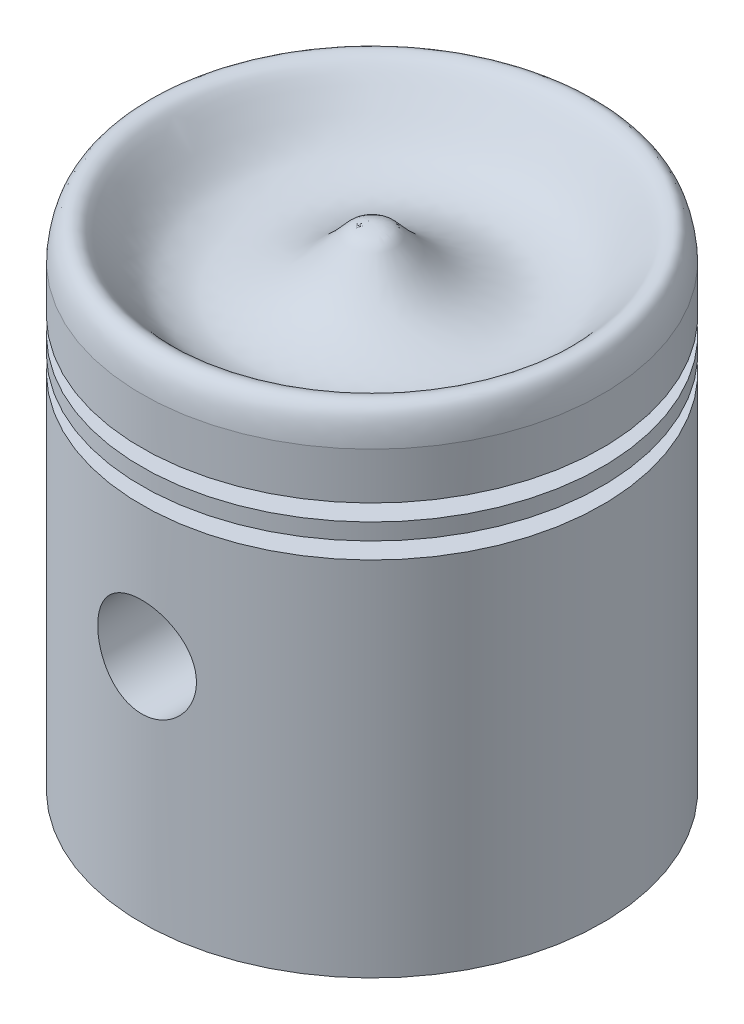
ISO-10303-21;
HEADER;
FILE_DESCRIPTION(('STEP AP214'),'2;1');
FILE_NAME('part.step','',(''),(''),'','','');
FILE_SCHEMA(('AUTOMOTIVE_DESIGN { 1 0 10303 214 1 1 1 1 }'));
ENDSEC;
DATA;
#1=APPLICATION_CONTEXT('core data for automotive mechanical design processes');
#2=APPLICATION_PROTOCOL_DEFINITION('international standard','automotive_design',2000,#1);
#3=PRODUCT_CONTEXT('',#1,'mechanical');
#4=PRODUCT('Part','Part','',(#3));
#5=PRODUCT_RELATED_PRODUCT_CATEGORY('part','',(#4));
#6=PRODUCT_DEFINITION_FORMATION('','',#4);
#7=PRODUCT_DEFINITION_CONTEXT('part definition',#1,'design');
#8=PRODUCT_DEFINITION('design','',#6,#7);
#9=PRODUCT_DEFINITION_SHAPE('','',#8);
#10=(LENGTH_UNIT() NAMED_UNIT(*) SI_UNIT(.MILLI.,.METRE.));
#11=(NAMED_UNIT(*) PLANE_ANGLE_UNIT() SI_UNIT($,.RADIAN.));
#12=(NAMED_UNIT(*) SI_UNIT($,.STERADIAN.) SOLID_ANGLE_UNIT());
#13=UNCERTAINTY_MEASURE_WITH_UNIT(LENGTH_MEASURE(1.E-05),#10,'distance_accuracy_value','');
#14=(GEOMETRIC_REPRESENTATION_CONTEXT(3) GLOBAL_UNCERTAINTY_ASSIGNED_CONTEXT((#13)) GLOBAL_UNIT_ASSIGNED_CONTEXT((#10,
#11,#12)) REPRESENTATION_CONTEXT('',''));
#15=CARTESIAN_POINT('',(0.,0.,0.));
#16=DIRECTION('',(0.,0.,1.));
#17=DIRECTION('',(1.,0.,0.));
#18=AXIS2_PLACEMENT_3D('',#15,#16,#17);
#19=CARTESIAN_POINT('',(1.19600567082175E-06,7.91996107381923,1.3474763766207E-05));
#20=DIRECTION('',(0.,-1.,0.));
#21=DIRECTION('',(0.,0.,-1.));
#22=AXIS2_PLACEMENT_3D('',#19,#20,#21);
#23=CONICAL_SURFACE('',#22,5.21420157956927,1.22173047639603);
#24=CARTESIAN_POINT('',(1.19600567082175E-06,9.81777524424625,1.3474763766207E-05));
#25=VERTEX_POINT('',#24);
#26=VERTEX_LOOP('',#25);
#27=FACE_BOUND('',#26,.T.);
#28=CARTESIAN_POINT('',(1.19600567082175E-06,7.91996107381923,1.3474763766207E-05));
#29=DIRECTION('',(0.,-1.,0.));
#30=DIRECTION('',(0.,0.,-1.));
#31=AXIS2_PLACEMENT_3D('',#28,#29,#30);
#32=CIRCLE('',#31,5.21420157956927);
#33=CARTESIAN_POINT('',(1.19600567082175E-06,7.91996107381923,-5.2141881048055));
#34=VERTEX_POINT('',#33);
#35=EDGE_CURVE('E82',#34,#34,#32,.T.);
#36=ORIENTED_EDGE('',*,*,#35,.T.);
#37=EDGE_LOOP('',(#36));
#38=FACE_BOUND('',#37,.T.);
#39=ADVANCED_FACE('F37',(#27,#38),#23,.F.);
#40=CARTESIAN_POINT('',(1.19600567881626E-06,13.0685139414464,1.3474763766207E-05));
#41=CARTESIAN_POINT('',(-0.281318780163342,13.0738620347917,1.3474763766207E-05));
#42=CARTESIAN_POINT('',(-0.771429235829669,12.9820264198062,1.3474763766207E-05));
#43=CARTESIAN_POINT('',(-1.48213308217972,12.148179381165,1.3474763766207E-05));
#44=CARTESIAN_POINT('',(-2.43239722922766,11.0926493268147,1.3474763766207E-05));
#45=CARTESIAN_POINT('',(-4.88677941059164,10.1867821782214,1.3474763766207E-05));
#46=CARTESIAN_POINT('',(-5.89422200956086,10.1979922281753,1.3474763766207E-05));
#47=CARTESIAN_POINT('',(-7.76024349303582,11.011464890764,1.3474763766207E-05));
#48=CARTESIAN_POINT('',(-9.02561347060041,12.8739887797501,1.3474763766207E-05));
#49=CARTESIAN_POINT('',(-9.85777467637345,13.2107307709268,1.3474763766207E-05));
#50=CARTESIAN_POINT('',(-10.3739113613338,13.0402652549594,1.3474763766207E-05));
#51=CARTESIAN_POINT('',(-10.4999988039943,11.5990791906284,1.3474763766207E-05));
#52=B_SPLINE_CURVE_WITH_KNOTS('',3,(#40,#41,#42,#43,#44,#45,#46,#47,#48,#49,#50,#51),
.UNSPECIFIED.,.F.,.F.,(4,1,1,1,1,1,1,1,1,4),(0.,0.0725474900971526,0.103319596306368,
0.285009788115958,0.33360778820772,0.540701597132226,0.586513163876913,0.745911888909903,
0.789253056585124,1.),.UNSPECIFIED.);
#53=CARTESIAN_POINT('',(1.19600567082175E-06,2.16213400546101,1.3474763766207E-05));
#54=DIRECTION('',(0.,-1.,0.));
#55=AXIS1_PLACEMENT('',#53,#54);
#56=SURFACE_OF_REVOLUTION('',#52,#55);
#57=CARTESIAN_POINT('',(1.19600567082175E-06,11.5990791906284,1.3474763766207E-05));
#58=DIRECTION('',(0.,-1.,0.));
#59=DIRECTION('',(0.,0.,-1.));
#60=AXIS2_PLACEMENT_3D('',#57,#58,#59);
#61=CIRCLE('',#60,10.5);
#62=CARTESIAN_POINT('',(1.19600567082175E-06,11.5990791906284,-10.4999865252362));
#63=VERTEX_POINT('',#62);
#64=EDGE_CURVE('E12',#63,#63,#61,.T.);
#65=ORIENTED_EDGE('',*,*,#64,.F.);
#66=EDGE_LOOP('',(#65));
#67=FACE_BOUND('',#66,.T.);
#68=CARTESIAN_POINT('',(1.19600567082175E-06,13.0685139414464,1.3474763766207E-05));
#69=VERTEX_POINT('',#68);
#70=VERTEX_LOOP('',#69);
#71=FACE_BOUND('',#70,.T.);
#72=ADVANCED_FACE('F57',(#67,#71),#56,.T.);
#73=CARTESIAN_POINT('',(1.19600567082175E-06,2.16213400546101,1.3474763766207E-05));
#74=DIRECTION('',(0.,-1.,0.));
#75=DIRECTION('',(0.,0.,-1.));
#76=AXIS2_PLACEMENT_3D('',#73,#74,#75);
#77=CYLINDRICAL_SURFACE('',#76,10.5);
#78=CARTESIAN_POINT('',(1.19600567082175E-06,9.47448732509958,1.3474763766207E-05));
#79=DIRECTION('',(0.,-1.,0.));
#80=DIRECTION('',(0.,0.,-1.));
#81=AXIS2_PLACEMENT_3D('',#78,#79,#80);
#82=CIRCLE('',#81,10.5);
#83=CARTESIAN_POINT('',(1.19600567082175E-06,9.47448732509958,-10.4999865252362));
#84=VERTEX_POINT('',#83);
#85=EDGE_CURVE('E50',#84,#84,#82,.T.);
#86=ORIENTED_EDGE('',*,*,#85,.F.);
#87=EDGE_LOOP('',(#86));
#88=FACE_BOUND('',#87,.T.);
#89=ORIENTED_EDGE('',*,*,#64,.T.);
#90=EDGE_LOOP('',(#89));
#91=FACE_BOUND('',#90,.T.);
#92=ADVANCED_FACE('F59',(#88,#91),#77,.T.);
#93=CARTESIAN_POINT('',(-10.4999988039943,9.47448732509958,1.3474763766207E-05));
#94=DIRECTION('',(0.,1.,0.));
#95=DIRECTION('',(0.,0.,1.));
#96=AXIS2_PLACEMENT_3D('',#93,#94,#95);
#97=PLANE('',#96);
#98=CARTESIAN_POINT('',(1.19600567082175E-06,9.47448732509958,1.3474763766207E-05));
#99=DIRECTION('',(0.,-1.,0.));
#100=DIRECTION('',(0.,0.,-1.));
#101=AXIS2_PLACEMENT_3D('',#98,#99,#100);
#102=CIRCLE('',#101,9.);
#103=CARTESIAN_POINT('',(1.19600567082175E-06,9.47448732509958,-8.99998652523623));
#104=VERTEX_POINT('',#103);
#105=EDGE_CURVE('E121',#104,#104,#102,.T.);
#106=ORIENTED_EDGE('',*,*,#105,.F.);
#107=EDGE_LOOP('',(#106));
#108=FACE_BOUND('',#107,.T.);
#109=ORIENTED_EDGE('',*,*,#85,.T.);
#110=EDGE_LOOP('',(#109));
#111=FACE_BOUND('',#110,.T.);
#112=ADVANCED_FACE('F65',(#108,#111),#97,.F.);
#113=CARTESIAN_POINT('',(1.19600567082175E-06,2.16213400546101,1.3474763766207E-05));
#114=DIRECTION('',(0.,-1.,0.));
#115=DIRECTION('',(0.,0.,-1.));
#116=AXIS2_PLACEMENT_3D('',#113,#114,#115);
#117=CYLINDRICAL_SURFACE('',#116,9.);
#118=CARTESIAN_POINT('',(1.19600567082175E-06,8.72448732509958,1.3474763766207E-05));
#119=DIRECTION('',(0.,-1.,0.));
#120=DIRECTION('',(0.,0.,-1.));
#121=AXIS2_PLACEMENT_3D('',#118,#119,#120);
#122=CIRCLE('',#121,9.);
#123=CARTESIAN_POINT('',(1.19600567082175E-06,8.72448732509958,-8.99998652523623));
#124=VERTEX_POINT('',#123);
#125=EDGE_CURVE('E118',#124,#124,#122,.T.);
#126=ORIENTED_EDGE('',*,*,#125,.F.);
#127=EDGE_LOOP('',(#126));
#128=FACE_BOUND('',#127,.T.);
#129=ORIENTED_EDGE('',*,*,#105,.T.);
#130=EDGE_LOOP('',(#129));
#131=FACE_BOUND('',#130,.T.);
#132=ADVANCED_FACE('F176',(#128,#131),#117,.T.);
#133=CARTESIAN_POINT('',(-10.4999988039943,8.72448732509958,1.3474763766207E-05));
#134=DIRECTION('',(0.,-1.,0.));
#135=DIRECTION('',(0.,0.,-1.));
#136=AXIS2_PLACEMENT_3D('',#133,#134,#135);
#137=PLANE('',#136);
#138=CARTESIAN_POINT('',(1.19600567082175E-06,8.72448732509958,1.3474763766207E-05));
#139=DIRECTION('',(0.,-1.,0.));
#140=DIRECTION('',(0.,0.,-1.));
#141=AXIS2_PLACEMENT_3D('',#138,#139,#140);
#142=CIRCLE('',#141,10.5);
#143=CARTESIAN_POINT('',(1.19600567082175E-06,8.72448732509958,-10.4999865252362));
#144=VERTEX_POINT('',#143);
#145=EDGE_CURVE('E115',#144,#144,#142,.T.);
#146=ORIENTED_EDGE('',*,*,#145,.F.);
#147=EDGE_LOOP('',(#146));
#148=FACE_BOUND('',#147,.T.);
#149=ORIENTED_EDGE('',*,*,#125,.T.);
#150=EDGE_LOOP('',(#149));
#151=FACE_BOUND('',#150,.T.);
#152=ADVANCED_FACE('F172',(#148,#151),#137,.F.);
#153=CARTESIAN_POINT('',(1.19600567082175E-06,2.16213400546101,1.3474763766207E-05));
#154=DIRECTION('',(0.,-1.,0.));
#155=DIRECTION('',(0.,0.,-1.));
#156=AXIS2_PLACEMENT_3D('',#153,#154,#155);
#157=CYLINDRICAL_SURFACE('',#156,10.5);
#158=CARTESIAN_POINT('',(1.19600567082175E-06,7.97448732509958,1.3474763766207E-05));
#159=DIRECTION('',(0.,-1.,0.));
#160=DIRECTION('',(0.,0.,-1.));
#161=AXIS2_PLACEMENT_3D('',#158,#159,#160);
#162=CIRCLE('',#161,10.5);
#163=CARTESIAN_POINT('',(1.19600567082175E-06,7.97448732509958,-10.4999865252362));
#164=VERTEX_POINT('',#163);
#165=EDGE_CURVE('E112',#164,#164,#162,.T.);
#166=ORIENTED_EDGE('',*,*,#165,.F.);
#167=EDGE_LOOP('',(#166));
#168=FACE_BOUND('',#167,.T.);
#169=ORIENTED_EDGE('',*,*,#145,.T.);
#170=EDGE_LOOP('',(#169));
#171=FACE_BOUND('',#170,.T.);
#172=ADVANCED_FACE('F168',(#168,#171),#157,.T.);
#173=CARTESIAN_POINT('',(-10.4999988039943,7.97448732509958,1.3474763766207E-05));
#174=DIRECTION('',(0.,1.,0.));
#175=DIRECTION('',(0.,0.,1.));
#176=AXIS2_PLACEMENT_3D('',#173,#174,#175);
#177=PLANE('',#176);
#178=CARTESIAN_POINT('',(1.19600567082175E-06,7.97448732509958,1.3474763766207E-05));
#179=DIRECTION('',(0.,-1.,0.));
#180=DIRECTION('',(0.,0.,-1.));
#181=AXIS2_PLACEMENT_3D('',#178,#179,#180);
#182=CIRCLE('',#181,9.);
#183=CARTESIAN_POINT('',(1.19600567082175E-06,7.97448732509958,-8.99998652523623));
#184=VERTEX_POINT('',#183);
#185=EDGE_CURVE('E109',#184,#184,#182,.T.);
#186=ORIENTED_EDGE('',*,*,#185,.F.);
#187=EDGE_LOOP('',(#186));
#188=FACE_BOUND('',#187,.T.);
#189=ORIENTED_EDGE('',*,*,#165,.T.);
#190=EDGE_LOOP('',(#189));
#191=FACE_BOUND('',#190,.T.);
#192=ADVANCED_FACE('F164',(#188,#191),#177,.F.);
#193=CARTESIAN_POINT('',(1.19600567082175E-06,2.16213400546101,1.3474763766207E-05));
#194=DIRECTION('',(0.,-1.,0.));
#195=DIRECTION('',(0.,0.,-1.));
#196=AXIS2_PLACEMENT_3D('',#193,#194,#195);
#197=CYLINDRICAL_SURFACE('',#196,9.);
#198=CARTESIAN_POINT('',(1.19600567082175E-06,7.22448732509958,1.3474763766207E-05));
#199=DIRECTION('',(0.,-1.,0.));
#200=DIRECTION('',(0.,0.,-1.));
#201=AXIS2_PLACEMENT_3D('',#198,#199,#200);
#202=CIRCLE('',#201,9.);
#203=CARTESIAN_POINT('',(1.19600567082175E-06,7.22448732509958,-8.99998652523623));
#204=VERTEX_POINT('',#203);
#205=EDGE_CURVE('E106',#204,#204,#202,.T.);
#206=ORIENTED_EDGE('',*,*,#205,.F.);
#207=EDGE_LOOP('',(#206));
#208=FACE_BOUND('',#207,.T.);
#209=ORIENTED_EDGE('',*,*,#185,.T.);
#210=EDGE_LOOP('',(#209));
#211=FACE_BOUND('',#210,.T.);
#212=ADVANCED_FACE('F160',(#208,#211),#197,.T.);
#213=CARTESIAN_POINT('',(-10.4999988039943,7.22448732509958,1.3474763766207E-05));
#214=DIRECTION('',(0.,-1.,0.));
#215=DIRECTION('',(0.,0.,-1.));
#216=AXIS2_PLACEMENT_3D('',#213,#214,#215);
#217=PLANE('',#216);
#218=CARTESIAN_POINT('',(1.19600567082175E-06,7.22448732509958,1.3474763766207E-05));
#219=DIRECTION('',(0.,-1.,0.));
#220=DIRECTION('',(0.,0.,-1.));
#221=AXIS2_PLACEMENT_3D('',#218,#219,#220);
#222=CIRCLE('',#221,10.5);
#223=CARTESIAN_POINT('',(1.19600567082175E-06,7.22448732509958,-10.4999865252362));
#224=VERTEX_POINT('',#223);
#225=EDGE_CURVE('E103',#224,#224,#222,.T.);
#226=ORIENTED_EDGE('',*,*,#225,.F.);
#227=EDGE_LOOP('',(#226));
#228=FACE_BOUND('',#227,.T.);
#229=ORIENTED_EDGE('',*,*,#205,.T.);
#230=EDGE_LOOP('',(#229));
#231=FACE_BOUND('',#230,.T.);
#232=ADVANCED_FACE('F154',(#228,#231),#217,.F.);
#233=CARTESIAN_POINT('',(1.19600567082175E-06,2.16213400546101,1.3474763766207E-05));
#234=DIRECTION('',(0.,-1.,0.));
#235=DIRECTION('',(0.,0.,-1.));
#236=AXIS2_PLACEMENT_3D('',#233,#234,#235);
#237=CYLINDRICAL_SURFACE('',#236,10.5);
#238=CARTESIAN_POINT('',(1.19600567082175E-06,3.47448732509958,-10.4999865252362));
#239=CARTESIAN_POINT('',(-0.124852633130254,3.47448297573813,-10.4999842158846));
#240=CARTESIAN_POINT('',(-0.249759597394741,3.4640599125178,-10.4977369144819));
#241=CARTESIAN_POINT('',(-0.49602982043432,3.42268383981919,-10.4889889726521));
#242=CARTESIAN_POINT('',(-0.617390409351114,3.39171575880718,-10.4824852097927));
#243=CARTESIAN_POINT('',(-0.852972789720934,3.31026077818753,-10.4659490020686));
#244=CARTESIAN_POINT('',(-0.967201749164163,3.2597938560276,-10.4559201697438));
#245=CARTESIAN_POINT('',(-1.18556607093551,3.14083619584268,-10.4334181275058));
#246=CARTESIAN_POINT('',(-1.28970177661538,3.07234607122467,-10.4209450007861));
#247=CARTESIAN_POINT('',(-1.48653598979717,2.91816687558932,-10.3947070639309));
#248=CARTESIAN_POINT('',(-1.57905635528601,2.83225299225179,-10.3809267723851));
#249=CARTESIAN_POINT('',(-1.74848943983585,2.64614785157178,-10.3537375724484));
#250=CARTESIAN_POINT('',(-1.82540081125795,2.54595536272269,-10.3403286962107));
#251=CARTESIAN_POINT('',(-1.96221186969146,2.33282869580893,-10.3152482659446));
#252=CARTESIAN_POINT('',(-2.02192317901946,2.21977104846527,-10.3035965704016));
#253=CARTESIAN_POINT('',(-2.12143115936154,1.98493564444932,-10.2835714086143));
#254=CARTESIAN_POINT('',(-2.16123010902007,1.86315888736072,-10.2751975672969));
#255=CARTESIAN_POINT('',(-2.21919742033115,1.61627069521747,-10.2628336591309));
#256=CARTESIAN_POINT('',(-2.23768050021947,1.49123641160378,-10.2587798786835));
#257=CARTESIAN_POINT('',(-2.25346973209298,1.23978097633909,-10.2553236229128));
#258=CARTESIAN_POINT('',(-2.25077837896377,1.11335998982966,-10.2559205996122));
#259=CARTESIAN_POINT('',(-2.22454869910725,0.865050293198891,-10.2616406742937));
#260=CARTESIAN_POINT('',(-2.20137478373545,0.74312099144935,-10.2666846504687));
#261=CARTESIAN_POINT('',(-2.13541461847448,0.504921964665567,-10.280605425873));
#262=CARTESIAN_POINT('',(-2.09262730804131,0.388652546051099,-10.2894824323623));
#263=CARTESIAN_POINT('',(-1.9883170701342,0.164043015789572,-10.3101477365721));
#264=CARTESIAN_POINT('',(-1.92665296858678,0.0557705560307528,-10.3219578399867));
#265=CARTESIAN_POINT('',(-1.78643891325423,-0.149025422337356,-10.3471451127556));
#266=CARTESIAN_POINT('',(-1.70788674554776,-0.245547397929723,-10.3605224874647));
#267=CARTESIAN_POINT('',(-1.53419194532413,-0.426201708410517,-10.3876773011444));
#268=CARTESIAN_POINT('',(-1.43873915494094,-0.510035734777526,-10.4014572848189));
#269=CARTESIAN_POINT('',(-1.23497476339797,-0.66055327543491,-10.4276117876921));
#270=CARTESIAN_POINT('',(-1.12666294715743,-0.727236502801003,-10.4399862833758));
#271=CARTESIAN_POINT('',(-0.899898997069268,-0.841628694760814,-10.4619732032463));
#272=CARTESIAN_POINT('',(-0.781427192289552,-0.889299793767394,-10.4715801048865));
#273=CARTESIAN_POINT('',(-0.537903524022888,-0.963976147382047,-10.4869081639162));
#274=CARTESIAN_POINT('',(-0.412852580694832,-0.990984283745393,-10.492629863142));
#275=CARTESIAN_POINT('',(-0.162280310249273,-1.02313699611555,-10.4994661204534));
#276=CARTESIAN_POINT('',(-0.0368135699017512,-1.02868924422309,-10.5006665730522));
#277=CARTESIAN_POINT('',(0.213254656481278,-1.01887581821267,-10.4985652592758));
#278=CARTESIAN_POINT('',(0.337856198196554,-1.00351150295601,-10.4952637853717));
#279=CARTESIAN_POINT('',(0.581315002979879,-0.952639309407866,-10.4845836709152));
#280=CARTESIAN_POINT('',(0.700218765368386,-0.917344120691619,-10.4772481009181));
#281=CARTESIAN_POINT('',(0.930418871715797,-0.827847260408187,-10.4593203915589));
#282=CARTESIAN_POINT('',(1.04171458488728,-0.773644023432938,-10.4487279825698));
#283=CARTESIAN_POINT('',(1.2552332929528,-0.64701236030993,-10.4252490910922));
#284=CARTESIAN_POINT('',(1.35731005867238,-0.574342982535828,-10.4123329955504));
#285=CARTESIAN_POINT('',(1.54796658429106,-0.413160437567316,-10.3857020207589));
#286=CARTESIAN_POINT('',(1.63654466404366,-0.324645301069255,-10.3719870423677));
#287=CARTESIAN_POINT('',(1.79929186187551,-0.132416619619716,-10.3450091158311));
#288=CARTESIAN_POINT('',(1.87317925483302,-0.0284625260672644,-10.3317584085555));
#289=CARTESIAN_POINT('',(2.00244742679628,0.19061921981657,-10.3074863436314));
#290=CARTESIAN_POINT('',(2.05782899471125,0.305746395565819,-10.2964648909571));
#291=CARTESIAN_POINT('',(2.14814731473389,0.543295773591486,-10.2780016723471));
#292=CARTESIAN_POINT('',(2.1831971756248,0.665673359745584,-10.2705401439807));
#293=CARTESIAN_POINT('',(2.2321916372857,0.914760700850035,-10.2600043258625));
#294=CARTESIAN_POINT('',(2.24613945770953,1.04146979190156,-10.2569293668318));
#295=CARTESIAN_POINT('',(2.25240119489628,1.29278583986245,-10.2555558079586));
#296=CARTESIAN_POINT('',(2.24516140488034,1.41738134757045,-10.2571586730144));
#297=CARTESIAN_POINT('',(2.21024803710063,1.66353318829846,-10.2647379730087));
#298=CARTESIAN_POINT('',(2.18257468037536,1.78508955417944,-10.2707143606369));
#299=CARTESIAN_POINT('',(2.10779138511218,2.02137531190333,-10.2863202417986));
#300=CARTESIAN_POINT('',(2.06074390356897,2.13612529809602,-10.2959379886068));
#301=CARTESIAN_POINT('',(1.94860246993968,2.35617038385985,-10.317747994096));
#302=CARTESIAN_POINT('',(1.88350672552817,2.46146454302215,-10.3299405084417));
#303=CARTESIAN_POINT('',(1.73562555124523,2.66181461568763,-10.3558223591347));
#304=CARTESIAN_POINT('',(1.65252100732422,2.75663186902005,-10.3695361743201));
#305=CARTESIAN_POINT('',(1.4716310279351,2.93112171888027,-10.3967482722317));
#306=CARTESIAN_POINT('',(1.37384221008407,3.01079081656789,-10.4102465045057));
#307=CARTESIAN_POINT('',(1.16490591690875,3.15366126435792,-10.435703890971));
#308=CARTESIAN_POINT('',(1.05360846502013,3.21664723444605,-10.4476419937956));
#309=CARTESIAN_POINT('',(0.821776437416568,3.32291911845885,-10.4684239167965));
#310=CARTESIAN_POINT('',(0.70124985480149,3.36622185897713,-10.4772703784214));
#311=CARTESIAN_POINT('',(0.483804022335477,3.4240156027963,-10.4892592521628));
#312=CARTESIAN_POINT('',(0.38807700432464,3.44290697606963,-10.4932574035602));
#313=CARTESIAN_POINT('',(0.194911137286441,3.46814427766708,-10.498621887557));
#314=CARTESIAN_POINT('',(0.0974723586387885,3.47449072056867,-10.4999883281059));
#315=CARTESIAN_POINT('',(1.19600567082175E-06,3.47448732509958,-10.4999865252362));
#316=B_SPLINE_CURVE_WITH_KNOTS('',3,(#238,#239,#240,#241,#242,#243,#244,#245,#246,#247,#248,
#249,#250,#251,#252,#253,#254,#255,#256,#257,#258,#259,#260,#261,#262,#263,#264,#265,#266,#267,
#268,#269,#270,#271,#272,#273,#274,#275,#276,#277,#278,#279,#280,#281,#282,#283,#284,#285,#286,
#287,#288,#289,#290,#291,#292,#293,#294,#295,#296,#297,#298,#299,#300,#301,#302,#303,#304,#305,
#306,#307,#308,#309,#310,#311,#312,#313,#314,#315),.UNSPECIFIED.,.T.,.F.,(4,2,2,2,2,2,2,2,2,2,2,
2,2,2,2,2,2,2,2,2,2,2,2,2,2,2,2,2,2,2,2,2,2,2,2,2,2,2,4),(0.,0.374204754768123,
0.748684324829904,1.1227812366384,1.49686541796883,1.87612442822598,2.2554161687776,
2.63871643821766,3.02197283516234,3.39949512186999,3.77697292753747,4.14786713179391,
4.51878139356852,4.89254034248952,5.26634831881334,5.64790516575436,6.02946839553525,
6.41178781709709,6.79405390884515,7.16901998556277,7.54396170347144,7.91497590883901,
8.28602083797651,8.66218100801704,9.03838795956727,9.42123094925301,9.80405761613708,
10.1847336061271,10.5653515084378,10.9380102081044,11.310664876624,11.6821274956018,
12.0536270167743,12.4323442523117,12.8111488559567,13.1946286553583,13.5777800101541,
13.8699269869844,14.16206198006),.UNSPECIFIED.);
#317=CARTESIAN_POINT('',(1.19600567082175E-06,3.47448732509958,-10.4999865252362));
#318=VERTEX_POINT('',#317);
#319=EDGE_CURVE('E76',#318,#318,#316,.T.);
#320=ORIENTED_EDGE('',*,*,#319,.T.);
#321=EDGE_LOOP('',(#320));
#322=FACE_BOUND('',#321,.T.);
#323=CARTESIAN_POINT('',(2.25000119600567,1.22448732509958,10.2561092231468));
#324=CARTESIAN_POINT('',(2.24999681958582,1.09967059637506,10.2561117431727));
#325=CARTESIAN_POINT('',(2.23957973967744,0.974800664185972,10.2584125598993));
#326=CARTESIAN_POINT('',(2.19822958480041,0.728607316737,10.2673511512052));
#327=CARTESIAN_POINT('',(2.16728129080993,0.607286602085386,10.2739921429396));
#328=CARTESIAN_POINT('',(2.08588415127473,0.371788700738159,10.2908252041667));
#329=CARTESIAN_POINT('',(2.0354562108754,0.257604007917351,10.3010134656516));
#330=CARTESIAN_POINT('',(1.91659046110576,0.039314414182696,10.323788537493));
#331=CARTESIAN_POINT('',(1.8481531767373,-0.0647907804440253,10.3363752779268));
#332=CARTESIAN_POINT('',(1.69402833455899,-0.26165711712361,10.3627571567137));
#333=CARTESIAN_POINT('',(1.60810408826541,-0.354230989260364,10.3765672228401));
#334=CARTESIAN_POINT('',(1.42195545820004,-0.523768006509095,10.4037088504197));
#335=CARTESIAN_POINT('',(1.32172999133218,-0.600729968190523,10.417040375535));
#336=CARTESIAN_POINT('',(1.10857212870254,-0.73759584163757,10.4418850114053));
#337=CARTESIAN_POINT('',(0.995521928350601,-0.797320158556347,10.4533784570552));
#338=CARTESIAN_POINT('',(0.760702600019564,-0.896854212069855,10.4730835404078));
#339=CARTESIAN_POINT('',(0.638934412076139,-0.93666609207984,10.4812955313137));
#340=CARTESIAN_POINT('',(0.392081977512938,-0.99465763129743,10.4934069539815));
#341=CARTESIAN_POINT('',(0.267075296901056,-1.01315406772906,10.4973694754395));
#342=CARTESIAN_POINT('',(0.0156746139656379,-1.02897959087031,10.5007539078688));
#343=CARTESIAN_POINT('',(-0.110719234241468,-1.02631100574155,10.5001763182542));
#344=CARTESIAN_POINT('',(-0.359124347870097,-1.00011922790504,10.4945939877021));
#345=CARTESIAN_POINT('',(-0.481173477037498,-0.976937424465538,10.4896617220502));
#346=CARTESIAN_POINT('',(-0.719607999961912,-0.910920652122624,10.4760065986003));
#347=CARTESIAN_POINT('',(-0.83599314425691,-0.868084818450808,10.4672835740115));
#348=CARTESIAN_POINT('',(-1.06075005032916,-0.76367048656764,10.4469097944666));
#349=CARTESIAN_POINT('',(-1.16905928951801,-0.701961524093898,10.435238761823));
#350=CARTESIAN_POINT('',(-1.3739101938386,-0.561649722655022,10.4102503809217));
#351=CARTESIAN_POINT('',(-1.47045031367162,-0.483044668949968,10.3969328169342));
#352=CARTESIAN_POINT('',(-1.6510519359973,-0.309309858108623,10.3698033716776));
#353=CARTESIAN_POINT('',(-1.73482556379809,-0.213881305864867,10.3559869303566));
#354=CARTESIAN_POINT('',(-1.88523245251525,-0.0101877472976592,10.3296669772434));
#355=CARTESIAN_POINT('',(-1.95186528576535,0.098077579207454,10.3171634982146));
#356=CARTESIAN_POINT('',(-2.06621996759378,0.324824076695221,10.2948738285646));
#357=CARTESIAN_POINT('',(-2.11388933032817,0.44333251087824,10.2850952016804));
#358=CARTESIAN_POINT('',(-2.18855123138106,0.68693647401924,10.269468586863));
#359=CARTESIAN_POINT('',(-2.21554690441375,0.812031001264367,10.263620003041));
#360=CARTESIAN_POINT('',(-2.24765259436411,1.06263095407415,10.2566366935955));
#361=CARTESIAN_POINT('',(-2.25318093292393,1.18808033771554,10.2554118805393));
#362=CARTESIAN_POINT('',(-2.24332589862993,1.43810831487212,10.2575720683737));
#363=CARTESIAN_POINT('',(-2.22794390021886,1.56268696507991,10.2609567662797));
#364=CARTESIAN_POINT('',(-2.17706722352809,1.80599297757072,10.2718697070268));
#365=CARTESIAN_POINT('',(-2.14180125776763,1.92477047399502,10.2793508038792));
#366=CARTESIAN_POINT('',(-2.05240459819557,2.15473083139896,10.2975713728104));
#367=CARTESIAN_POINT('',(-1.9982721589366,2.26591298855087,10.3083111463565));
#368=CARTESIAN_POINT('',(-1.8717513702449,2.47934185223796,10.3320379859689));
#369=CARTESIAN_POINT('',(-1.79910433285621,2.58143169811786,10.3450560009585));
#370=CARTESIAN_POINT('',(-1.63795656149834,2.77212484391027,10.3717901051659));
#371=CARTESIAN_POINT('',(-1.54945394172674,2.86072653727228,10.3855062772807));
#372=CARTESIAN_POINT('',(-1.35721795062555,3.02354277951672,10.4123870746164));
#373=CARTESIAN_POINT('',(-1.25324119273748,3.0974726993351,10.42553750888));
#374=CARTESIAN_POINT('',(-1.03410102591774,3.22681543912615,10.4495476354873));
#375=CARTESIAN_POINT('',(-0.918938128059937,3.28222910455883,10.4604074324142));
#376=CARTESIAN_POINT('',(-0.68139693246739,3.3725654070573,10.4785526504874));
#377=CARTESIAN_POINT('',(-0.55906859360709,3.407614780719,10.4858601318192));
#378=CARTESIAN_POINT('',(-0.310086569499262,3.45662488369806,10.4961725642935));
#379=CARTESIAN_POINT('',(-0.183433488955313,3.47058854906044,10.4991781144483));
#380=CARTESIAN_POINT('',(0.0678967715849089,3.47690330371738,10.5005311398995));
#381=CARTESIAN_POINT('',(0.192562954269494,3.46968006300655,10.4989703597883));
#382=CARTESIAN_POINT('',(0.438860603629634,3.434775179821,10.491561760215));
#383=CARTESIAN_POINT('',(0.560492120613678,3.40709387673196,10.4857140118709));
#384=CARTESIAN_POINT('',(0.796954118736496,3.33225911572548,10.47039430434));
#385=CARTESIAN_POINT('',(0.911803743615142,3.28516379102176,10.4609331712145));
#386=CARTESIAN_POINT('',(1.1320286310908,3.17289541834539,10.4393990155304));
#387=CARTESIAN_POINT('',(1.23740301320098,3.10772069263862,10.4273257505939));
#388=CARTESIAN_POINT('',(1.43776965634742,2.95974384698752,10.4016106237557));
#389=CARTESIAN_POINT('',(1.53253674366012,2.87664108762495,10.387944108286));
#390=CARTESIAN_POINT('',(1.70692621787452,2.69577640971671,10.3607188259972));
#391=CARTESIAN_POINT('',(1.78654496695774,2.59801098003874,10.3471600858072));
#392=CARTESIAN_POINT('',(1.92935011994238,2.38910158534515,10.3214938791793));
#393=CARTESIAN_POINT('',(1.9923146630945,2.2778032877655,10.309407062749));
#394=CARTESIAN_POINT('',(2.0985462658477,2.04597174381196,10.2883109318478));
#395=CARTESIAN_POINT('',(2.14183029235112,1.92544655724569,10.2792989681744));
#396=CARTESIAN_POINT('',(2.19958030283823,1.70804812830532,10.2670718846324));
#397=CARTESIAN_POINT('',(2.21845248362431,1.61236981153366,10.2629877211475));
#398=CARTESIAN_POINT('',(2.24366435665474,1.41930085773778,10.2575054672654));
#399=CARTESIAN_POINT('',(2.25000461192465,1.32191029783835,10.2561072561956));
#400=CARTESIAN_POINT('',(2.25000119600567,1.22448732509958,10.2561092231468));
#401=B_SPLINE_CURVE_WITH_KNOTS('',3,(#323,#324,#325,#326,#327,#328,#329,#330,#331,#332,#333,
#334,#335,#336,#337,#338,#339,#340,#341,#342,#343,#344,#345,#346,#347,#348,#349,#350,#351,#352,
#353,#354,#355,#356,#357,#358,#359,#360,#361,#362,#363,#364,#365,#366,#367,#368,#369,#370,#371,
#372,#373,#374,#375,#376,#377,#378,#379,#380,#381,#382,#383,#384,#385,#386,#387,#388,#389,#390,
#391,#392,#393,#394,#395,#396,#397,#398,#399,#400),.UNSPECIFIED.,.T.,.F.,(4,2,2,2,2,2,2,2,2,2,2,
2,2,2,2,2,2,2,2,2,2,2,2,2,2,2,2,2,2,2,2,2,2,2,2,2,2,2,4),(0.,0.374093223041292,
0.748464057719946,1.12243423672914,1.49639351510292,1.87579844374038,2.25523212169318,
2.63848702230417,3.02170065969401,3.39914262227893,3.77654306665861,4.14777836501057,
4.51902999911376,4.89290832215156,5.26683568308472,5.64823441168942,6.02964265534638,
6.41209931117671,6.79449796430758,7.16940649788784,7.54429038980875,7.91494771124062,
8.28563933344725,8.66182515324477,9.03805574488617,9.42099322024815,9.80391320813312,
10.1844238473656,10.5648814981281,10.9377479946619,11.3106083057265,11.6823601442922,
12.0541464922705,12.4327337124145,12.8114117344685,13.1949057025222,13.5780684242056,
13.8700718418644,14.1620621403007),.UNSPECIFIED.);
#402=CARTESIAN_POINT('',(2.25000119600567,1.22448732509958,10.2561092231468));
#403=VERTEX_POINT('',#402);
#404=EDGE_CURVE('E143',#403,#403,#401,.T.);
#405=ORIENTED_EDGE('',*,*,#404,.T.);
#406=EDGE_LOOP('',(#405));
#407=FACE_BOUND('',#406,.T.);
#408=CARTESIAN_POINT('',(1.19600567082175E-06,-9.27551267490042,1.3474763766207E-05));
#409=DIRECTION('',(0.,-1.,0.));
#410=DIRECTION('',(0.,0.,-1.));
#411=AXIS2_PLACEMENT_3D('',#408,#409,#410);
#412=CIRCLE('',#411,10.5);
#413=CARTESIAN_POINT('',(1.19600567082175E-06,-9.27551267490042,-10.4999865252362));
#414=VERTEX_POINT('',#413);
#415=EDGE_CURVE('E100',#414,#414,#412,.T.);
#416=ORIENTED_EDGE('',*,*,#415,.F.);
#417=EDGE_LOOP('',(#416));
#418=FACE_BOUND('',#417,.T.);
#419=ORIENTED_EDGE('',*,*,#225,.T.);
#420=EDGE_LOOP('',(#419));
#421=FACE_BOUND('',#420,.T.);
#422=ADVANCED_FACE('F148',(#322,#407,#418,#421),#237,.T.);
#423=CARTESIAN_POINT('',(-10.4999988039943,-9.27551267490042,1.3474763766207E-05));
#424=DIRECTION('',(0.,1.,0.));
#425=DIRECTION('',(0.,0.,1.));
#426=AXIS2_PLACEMENT_3D('',#423,#424,#425);
#427=PLANE('',#426);
#428=CARTESIAN_POINT('',(1.19600567082175E-06,-9.27551267490042,1.3474763766207E-05));
#429=DIRECTION('',(0.,-1.,0.));
#430=DIRECTION('',(0.,0.,-1.));
#431=AXIS2_PLACEMENT_3D('',#428,#429,#430);
#432=CIRCLE('',#431,9.375);
#433=CARTESIAN_POINT('',(1.19600567082175E-06,-9.27551267490042,-9.37498652523623));
#434=VERTEX_POINT('',#433);
#435=EDGE_CURVE('E97',#434,#434,#432,.T.);
#436=ORIENTED_EDGE('',*,*,#435,.F.);
#437=EDGE_LOOP('',(#436));
#438=FACE_BOUND('',#437,.T.);
#439=ORIENTED_EDGE('',*,*,#415,.T.);
#440=EDGE_LOOP('',(#439));
#441=FACE_BOUND('',#440,.T.);
#442=ADVANCED_FACE('F153',(#438,#441),#427,.F.);
#443=CARTESIAN_POINT('',(1.19600567082175E-06,-9.27551267490042,1.3474763766207E-05));
#444=DIRECTION('',(0.,-1.,0.));
#445=DIRECTION('',(0.,0.,-1.));
#446=AXIS2_PLACEMENT_3D('',#443,#444,#445);
#447=CONICAL_SURFACE('',#446,9.375,0.349065850398866);
#448=CARTESIAN_POINT('',(1.19600567082175E-06,-4.33236855913765,1.3474763766207E-05));
#449=DIRECTION('',(0.,-1.,0.));
#450=DIRECTION('',(0.,0.,-1.));
#451=AXIS2_PLACEMENT_3D('',#448,#449,#450);
#452=CIRCLE('',#451,7.57584267817422);
#453=CARTESIAN_POINT('',(1.19600567082175E-06,-4.33236855913765,-7.57582920341046));
#454=VERTEX_POINT('',#453);
#455=EDGE_CURVE('E94',#454,#454,#452,.T.);
#456=ORIENTED_EDGE('',*,*,#455,.F.);
#457=EDGE_LOOP('',(#456));
#458=FACE_BOUND('',#457,.T.);
#459=ORIENTED_EDGE('',*,*,#435,.T.);
#460=EDGE_LOOP('',(#459));
#461=FACE_BOUND('',#460,.T.);
#462=ADVANCED_FACE('F225',(#458,#461),#447,.F.);
#463=CARTESIAN_POINT('',(1.19600567082175E-06,-1.77551267490042,1.3474763766207E-05));
#464=DIRECTION('',(0.,-1.,0.));
#465=DIRECTION('',(0.,0.,-1.));
#466=AXIS2_PLACEMENT_3D('',#463,#464,#465);
#467=TOROIDAL_SURFACE('',#466,14.6007464849157,7.47574648491569);
#468=CARTESIAN_POINT('',(1.19600567082175E-06,-1.77551267490042,1.3474763766207E-05));
#469=DIRECTION('',(0.,-1.,0.));
#470=DIRECTION('',(0.,0.,-1.));
#471=AXIS2_PLACEMENT_3D('',#468,#469,#470);
#472=CIRCLE('',#471,7.125);
#473=CARTESIAN_POINT('',(1.19600567082175E-06,-1.77551267490042,-7.12498652523623));
#474=VERTEX_POINT('',#473);
#475=EDGE_CURVE('E91',#474,#474,#472,.T.);
#476=ORIENTED_EDGE('',*,*,#475,.F.);
#477=EDGE_LOOP('',(#476));
#478=FACE_BOUND('',#477,.T.);
#479=ORIENTED_EDGE('',*,*,#455,.T.);
#480=EDGE_LOOP('',(#479));
#481=FACE_BOUND('',#480,.T.);
#482=ADVANCED_FACE('F232',(#478,#481),#467,.T.);
#483=CARTESIAN_POINT('',(1.19600567082175E-06,2.16213400546101,1.3474763766207E-05));
#484=DIRECTION('',(0.,-1.,0.));
#485=DIRECTION('',(0.,0.,-1.));
#486=AXIS2_PLACEMENT_3D('',#483,#484,#485);
#487=CYLINDRICAL_SURFACE('',#486,7.125);
#488=CARTESIAN_POINT('',(1.19600567082175E-06,3.47448732509958,-7.12498652523623));
#489=CARTESIAN_POINT('',(0.123126513102777,3.47448671910393,-7.12498604380546));
#490=CARTESIAN_POINT('',(0.246258440758411,3.46434752085767,-7.12176495928709));
#491=CARTESIAN_POINT('',(0.488917370952916,3.42416765126481,-7.1092312466079));
#492=CARTESIAN_POINT('',(0.608443621194354,3.39412285638368,-7.0999173562998));
#493=CARTESIAN_POINT('',(0.840357100262187,3.31524889082357,-7.07621467304158));
#494=CARTESIAN_POINT('',(0.952755197142095,3.26644915843914,-7.06183383624713));
#495=CARTESIAN_POINT('',(1.16777306481649,3.15157702045654,-7.02947946422972));
#496=CARTESIAN_POINT('',(1.27039122859516,3.08550178284192,-7.01150534006404));
#497=CARTESIAN_POINT('',(1.46616581413742,2.93576631895994,-6.97323717516844));
#498=CARTESIAN_POINT('',(1.5589713948389,2.85166055199441,-6.95289180044505));
#499=CARTESIAN_POINT('',(1.72942233521455,2.66919990491542,-6.91246917876287));
#500=CARTESIAN_POINT('',(1.80706479643082,2.57084230678546,-6.89239198374909));
#501=CARTESIAN_POINT('',(1.94690319880932,2.35961415192576,-6.85422597803401));
#502=CARTESIAN_POINT('',(2.00865812629325,2.24643911993336,-6.83620040508006));
#503=CARTESIAN_POINT('',(2.1121120359142,2.01064863243522,-6.80495195651906));
#504=CARTESIAN_POINT('',(2.15381642852238,1.88803573403157,-6.79172778552943));
#505=CARTESIAN_POINT('',(2.21469665759994,1.64081397154542,-6.77211693444162));
#506=CARTESIAN_POINT('',(2.23452435012098,1.51638172348638,-6.76553294723502));
#507=CARTESIAN_POINT('',(2.25312505694539,1.2657959777698,-6.75936244177275));
#508=CARTESIAN_POINT('',(2.25190380508378,1.13964295821475,-6.75977401789112));
#509=CARTESIAN_POINT('',(2.22895055307639,0.894614046841228,-6.76737416729157));
#510=CARTESIAN_POINT('',(2.2080505178675,0.775650250738333,-6.7742878361857));
#511=CARTESIAN_POINT('',(2.14768316608955,0.54301253393568,-6.79366608636736));
#512=CARTESIAN_POINT('',(2.1082138381004,0.429339187762034,-6.80613126898536));
#513=CARTESIAN_POINT('',(2.0112474572747,0.208541423286098,-6.83541641462175));
#514=CARTESIAN_POINT('',(1.95349145387768,0.101539290367357,-6.85229828373539));
#515=CARTESIAN_POINT('',(1.8217710213799,-0.10152591142478,-6.88848665323066));
#516=CARTESIAN_POINT('',(1.74780230738488,-0.197586078202154,-6.9077937940159));
#517=CARTESIAN_POINT('',(1.58168702245137,-0.380739717148172,-6.94775684827954));
#518=CARTESIAN_POINT('',(1.48885463839255,-0.467207768511605,-6.96843371373752));
#519=CARTESIAN_POINT('',(1.28974999690246,-0.623502535305574,-7.00801491436816));
#520=CARTESIAN_POINT('',(1.18347670219004,-0.693327965167036,-7.02691911254171));
#521=CARTESIAN_POINT('',(0.959283062462028,-0.814791241612585,-7.06103077602431));
#522=CARTESIAN_POINT('',(0.84127530085001,-0.866277093937015,-7.07620703810038));
#523=CARTESIAN_POINT('',(0.597682605543178,-0.948479841603378,-7.10092747183177));
#524=CARTESIAN_POINT('',(0.472100036543357,-0.979203182385022,-7.11047339123332));
#525=CARTESIAN_POINT('',(0.222229109007265,-1.01793686360914,-7.12257505607902));
#526=CARTESIAN_POINT('',(0.0980843779351568,-1.02679362360394,-7.12539115620889));
#527=CARTESIAN_POINT('',(-0.149932338214959,-1.02393299877587,-7.12448756212962));
#528=CARTESIAN_POINT('',(-0.273804361300902,-1.0122186902074,-7.12076884515502));
#529=CARTESIAN_POINT('',(-0.514475713672486,-0.969226540074314,-7.10738467715734));
#530=CARTESIAN_POINT('',(-0.631374833915371,-0.938454787981294,-7.09787316485505));
#531=CARTESIAN_POINT('',(-0.858316161621236,-0.858841115195856,-7.07401978434042));
#532=CARTESIAN_POINT('',(-0.968357515048698,-0.809996949079587,-7.05967731592132));
#533=CARTESIAN_POINT('',(-1.18148337582955,-0.694278039804864,-7.02719323797112));
#534=CARTESIAN_POINT('',(-1.28432895248738,-0.626987789290817,-7.00896654946084));
#535=CARTESIAN_POINT('',(-1.47755115137621,-0.476783693211316,-6.97079566569412));
#536=CARTESIAN_POINT('',(-1.56792431223038,-0.393865525589273,-6.95085099614336));
#537=CARTESIAN_POINT('',(-1.7374388708439,-0.210777779786441,-6.91047376499006));
#538=CARTESIAN_POINT('',(-1.81597680950603,-0.110045334043242,-6.89005417855973));
#539=CARTESIAN_POINT('',(-1.95509140394999,0.103612382914699,-6.85188112226604));
#540=CARTESIAN_POINT('',(-2.01566828730517,0.216537499618968,-6.83412761862381));
#541=CARTESIAN_POINT('',(-2.11677703537506,0.451180248420531,-6.80349096885862));
#542=CARTESIAN_POINT('',(-2.15738159953908,0.572864115485964,-6.79059019970286));
#543=CARTESIAN_POINT('',(-2.21737338535001,0.821834525283523,-6.77124105227708));
#544=CARTESIAN_POINT('',(-2.23676890266185,0.949118857181742,-6.76479015130291));
#545=CARTESIAN_POINT('',(-2.25318811308035,1.19935771399489,-6.75933777705092));
#546=CARTESIAN_POINT('',(-2.25120351526395,1.32224076509725,-6.76000606600309));
#547=CARTESIAN_POINT('',(-2.22732005192051,1.56582981192898,-6.76791232857686));
#548=CARTESIAN_POINT('',(-2.20542215257815,1.68653591299322,-6.77514998345566));
#549=CARTESIAN_POINT('',(-2.14300365292835,1.92053003127336,-6.79514631180862));
#550=CARTESIAN_POINT('',(-2.10277256367889,2.0339031842821,-6.80781898086426));
#551=CARTESIAN_POINT('',(-2.00505855872904,2.25238031878278,-6.83723390898074));
#552=CARTESIAN_POINT('',(-1.94757208100259,2.35748258725828,-6.85397700816381));
#553=CARTESIAN_POINT('',(-1.81430190595123,2.56096744304587,-6.89047829211863));
#554=CARTESIAN_POINT('',(-1.73788057342831,2.65891558750217,-6.9103300127724));
#555=CARTESIAN_POINT('',(-1.57002516497518,2.84091858154562,-6.95038774333326));
#556=CARTESIAN_POINT('',(-1.47858703949805,2.92496967124028,-6.97059384748976));
#557=CARTESIAN_POINT('',(-1.27959829363025,3.07962271155721,-7.00989817067054));
#558=CARTESIAN_POINT('',(-1.17160953926717,3.14967791119408,-7.0289363567968));
#559=CARTESIAN_POINT('',(-0.944788013258618,3.27054985165607,-7.0629972138813));
#560=CARTESIAN_POINT('',(-0.825959301952394,3.32137375955146,-7.07802138015976));
#561=CARTESIAN_POINT('',(-0.590452676461052,3.39888547875442,-7.10138617144749));
#562=CARTESIAN_POINT('',(-0.474336503773985,3.42715314447797,-7.11015843290023));
#563=CARTESIAN_POINT('',(-0.238814757920178,3.46495236909625,-7.12195823235264));
#564=CARTESIAN_POINT('',(-0.119409889828456,3.47448791281461,-7.12498699214404));
#565=CARTESIAN_POINT('',(1.19600567082175E-06,3.47448732509958,-7.12498652523623));
#566=B_SPLINE_CURVE_WITH_KNOTS('',3,(#488,#489,#490,#491,#492,#493,#494,#495,#496,#497,#498,
#499,#500,#501,#502,#503,#504,#505,#506,#507,#508,#509,#510,#511,#512,#513,#514,#515,#516,#517,
#518,#519,#520,#521,#522,#523,#524,#525,#526,#527,#528,#529,#530,#531,#532,#533,#534,#535,#536,
#537,#538,#539,#540,#541,#542,#543,#544,#545,#546,#547,#548,#549,#550,#551,#552,#553,#554,#555,
#556,#557,#558,#559,#560,#561,#562,#563,#564,#565),.UNSPECIFIED.,.T.,.F.,(4,2,2,2,2,2,2,2,2,2,2,
2,2,2,2,2,2,2,2,2,2,2,2,2,2,2,2,2,2,2,2,2,2,2,2,2,2,2,4),(0.,0.368936956279035,
0.737950363426831,1.10638690651349,1.4748838862292,1.85383074912876,2.23284997766309,
2.62146853564894,3.00998216918917,3.38657747436771,3.76307019477174,4.12432817725207,
4.48562530009869,4.85228645746297,5.2190446376417,5.60287271109721,5.98673042397576,
6.37369924387384,6.76054787930612,7.13216952810688,7.50373560831265,7.86583408590447,
8.22797756787321,8.59906486784471,8.97025494671013,9.3564849882041,9.74271013580861,
10.1275188197047,10.5121769363906,10.8790726445808,11.2459505521015,11.6072255414006,
11.9685751599655,12.3443187866269,12.7201639061633,13.1086368233147,13.4969648224154,
13.8548484674225,14.2126559727536),.UNSPECIFIED.);
#567=CARTESIAN_POINT('',(1.19600567082175E-06,3.47448732509958,-7.12498652523623));
#568=VERTEX_POINT('',#567);
#569=EDGE_CURVE('E40',#568,#568,#566,.T.);
#570=ORIENTED_EDGE('',*,*,#569,.T.);
#571=EDGE_LOOP('',(#570));
#572=FACE_BOUND('',#571,.T.);
#573=CARTESIAN_POINT('',(2.25000119600567,1.22448732509958,6.76042211625875));
#574=CARTESIAN_POINT('',(2.2500005660734,1.34743974911379,6.7604227174958));
#575=CARTESIAN_POINT('',(2.2398887994809,1.4703988006867,6.76381303787504));
#576=CARTESIAN_POINT('',(2.19982776931208,1.71269983934875,6.77694646283092));
#577=CARTESIAN_POINT('',(2.16987347797447,1.83204090168361,6.78669117749418));
#578=CARTESIAN_POINT('',(2.09126382129453,2.06356062937388,6.8113219965727));
#579=CARTESIAN_POINT('',(2.04264208906684,2.17575175531685,6.82619884955476));
#580=CARTESIAN_POINT('',(1.92819039578922,2.39041640910655,6.85940475467747));
#581=CARTESIAN_POINT('',(1.86235727353205,2.49288814708153,6.87773444082521));
#582=CARTESIAN_POINT('',(1.71287797057483,2.68880033227767,6.91650198179557));
#583=CARTESIAN_POINT('',(1.628731653412,2.78184967070345,6.93698835825257));
#584=CARTESIAN_POINT('',(1.44608432897127,2.95277885433484,6.97734854116103));
#585=CARTESIAN_POINT('',(1.34758127635633,3.03065653440505,6.99722225984043));
#586=CARTESIAN_POINT('',(1.13619845105827,3.17076508428765,7.03467396350231));
#587=CARTESIAN_POINT('',(1.02303869758988,3.23259209265461,7.05218816794856));
#588=CARTESIAN_POINT('',(0.787279297141008,3.33618321093645,7.08238007000714));
#589=CARTESIAN_POINT('',(0.664681926837309,3.37795214205881,7.09505892970354));
#590=CARTESIAN_POINT('',(0.417623359745884,3.43893242175125,7.11380809751497));
#591=CARTESIAN_POINT('',(0.29334232272084,3.45881247728367,7.12007387437824));
#592=CARTESIAN_POINT('',(0.0430612889211157,3.47757058124593,7.12598179286826));
#593=CARTESIAN_POINT('',(-0.0829383022984643,3.47645350186468,7.12562547109132));
#594=CARTESIAN_POINT('',(-0.328369233022118,3.45368652576577,7.11846488501624));
#595=CARTESIAN_POINT('',(-0.447875546464104,3.43276175052434,7.1118883382516));
#596=CARTESIAN_POINT('',(-0.681584271626562,3.37216458862391,7.09330721705568));
#597=CARTESIAN_POINT('',(-0.795786334498165,3.33249097080696,7.08130228616738));
#598=CARTESIAN_POINT('',(-1.01730428300687,3.23506305227248,7.05291002816102));
#599=CARTESIAN_POINT('',(-1.12451732393776,3.17709083358613,7.03647024875845));
#600=CARTESIAN_POINT('',(-1.32791745756298,3.04488685321836,7.00093722277581));
#601=CARTESIAN_POINT('',(-1.42410170759617,2.97065091386428,6.98184329488432));
#602=CARTESIAN_POINT('',(-1.60703636560705,2.8043143757492,6.9420733206502));
#603=CARTESIAN_POINT('',(-1.69321188361267,2.71158847402833,6.92136452319152));
#604=CARTESIAN_POINT('',(-1.84896331981953,2.51281008662323,6.8813968614788));
#605=CARTESIAN_POINT('',(-1.91853719564107,2.40675596371217,6.86213817582078));
#606=CARTESIAN_POINT('',(-2.0397983843628,2.18267716737554,6.82708383535914));
#607=CARTESIAN_POINT('',(-2.09126825853766,2.06452761727107,6.81133106200877));
#608=CARTESIAN_POINT('',(-2.17339894072827,1.82062017262536,6.78557395789769));
#609=CARTESIAN_POINT('',(-2.2040674135442,1.69486509915456,6.77556750996729));
#610=CARTESIAN_POINT('',(-2.24260623369273,1.4448337845927,6.76290738194053));
#611=CARTESIAN_POINT('',(-2.25135863332586,1.32070781957581,6.7599694189777));
#612=CARTESIAN_POINT('',(-2.24829651347366,1.07275075115548,6.76098878667044));
#613=CARTESIAN_POINT('',(-2.23648525480443,0.948919604120161,6.76494502410041));
#614=CARTESIAN_POINT('',(-2.19342007296885,0.708897293251936,6.77902592463687));
#615=CARTESIAN_POINT('',(-2.16275459186392,0.592588444098767,6.78896371253933));
#616=CARTESIAN_POINT('',(-2.08354465428939,0.366781426381753,6.81368880751718));
#617=CARTESIAN_POINT('',(-2.03499724130922,0.257284387550352,6.82847691647645));
#618=CARTESIAN_POINT('',(-1.91978691600815,0.0446747695172074,6.8617715622662));
#619=CARTESIAN_POINT('',(-1.85263701721065,-0.0581585173112323,6.880373957527));
#620=CARTESIAN_POINT('',(-1.70269378423907,-0.251418243538245,6.91900463904147));
#621=CARTESIAN_POINT('',(-1.61989630095333,-0.341841381260512,6.93903330260446));
#622=CARTESIAN_POINT('',(-1.43682786029101,-0.51167533981241,6.97928867659141));
#623=CARTESIAN_POINT('',(-1.33596430165898,-0.59045564923304,6.99948769469838));
#624=CARTESIAN_POINT('',(-1.12195884494025,-0.729999637187416,7.03695981171618));
#625=CARTESIAN_POINT('',(-1.00881749376409,-0.790764117781146,7.05423304086769));
#626=CARTESIAN_POINT('',(-0.7741477366706,-0.891971218697868,7.08381100538636));
#627=CARTESIAN_POINT('',(-0.652686726144043,-0.932559222577202,7.09615115630276));
#628=CARTESIAN_POINT('',(-0.404202903232131,-0.992592241414916,7.11462803486392));
#629=CARTESIAN_POINT('',(-0.277181885497872,-1.01204402709829,7.12076674901761));
#630=CARTESIAN_POINT('',(-0.0269817768760665,-1.02869312979921,7.12601462235262));
#631=CARTESIAN_POINT('',(0.0961314502364664,-1.02680027897296,7.12541118169742));
#632=CARTESIAN_POINT('',(0.340206027450218,-1.00302085689635,7.11793390980795));
#633=CARTESIAN_POINT('',(0.461167522376985,-0.981135636492846,7.1110605022236));
#634=CARTESIAN_POINT('',(0.695955951152418,-0.918576084986093,7.0919088453265));
#635=CARTESIAN_POINT('',(0.809855205167136,-0.878149775779024,7.07970203926848));
#636=CARTESIAN_POINT('',(1.02930771378028,-0.779880390008501,7.05114189170461));
#637=CARTESIAN_POINT('',(1.13485951867494,-0.722034296496634,7.03478783200963));
#638=CARTESIAN_POINT('',(1.33857443107657,-0.588266695690211,6.99893603520148));
#639=CARTESIAN_POINT('',(1.43635827540646,-0.511791667791934,6.97934948267577));
#640=CARTESIAN_POINT('',(1.61800634246527,-0.343907856152733,6.93949104429403));
#641=CARTESIAN_POINT('',(1.70186634238497,-0.252494558566313,6.91921895276395));
#642=CARTESIAN_POINT('',(1.85617038158806,-0.0536005107422156,6.87946371576036));
#643=CARTESIAN_POINT('',(1.92606053335936,0.0543212724866845,6.86003092001017));
#644=CARTESIAN_POINT('',(2.04663960874572,0.28096641018058,6.82503065120432));
#645=CARTESIAN_POINT('',(2.09733589174044,0.399685602967105,6.80946169745137));
#646=CARTESIAN_POINT('',(2.17462470355888,0.634907003956441,6.78515547300765));
#647=CARTESIAN_POINT('',(2.20280642705251,0.750841993886433,6.77597528664602));
#648=CARTESIAN_POINT('',(2.24049255091038,0.986012263878441,6.76360909589398));
#649=CARTESIAN_POINT('',(2.25000180692109,1.10524667776716,6.76042153317227));
#650=CARTESIAN_POINT('',(2.25000119600567,1.22448732509958,6.76042211625875));
#651=B_SPLINE_CURVE_WITH_KNOTS('',3,(#573,#574,#575,#576,#577,#578,#579,#580,#581,#582,#583,
#584,#585,#586,#587,#588,#589,#590,#591,#592,#593,#594,#595,#596,#597,#598,#599,#600,#601,#602,
#603,#604,#605,#606,#607,#608,#609,#610,#611,#612,#613,#614,#615,#616,#617,#618,#619,#620,#621,
#622,#623,#624,#625,#626,#627,#628,#629,#630,#631,#632,#633,#634,#635,#636,#637,#638,#639,#640,
#641,#642,#643,#644,#645,#646,#647,#648,#649,#650),.UNSPECIFIED.,.T.,.F.,(4,2,2,2,2,2,2,2,2,2,2,
2,2,2,2,2,2,2,2,2,2,2,2,2,2,2,2,2,2,2,2,2,2,2,2,2,2,2,4),(0.,0.368416635868909,
0.736926658028676,1.10477582826865,1.47269260870136,1.85231600946379,2.23199354636009,
2.62045867345783,3.00883038135359,3.38497640370905,3.76103514597346,4.12383870019151,
4.48666608151025,4.85398865403346,5.22140569180914,5.6044425203106,5.98752644679031,
6.37506578961951,6.76246225612876,7.13399680232382,7.50547243898702,7.86590462139821,
8.22639642266008,8.59740060479462,8.96850330073329,9.35536120904717,9.74220189196121,
10.1262132212911,10.5101015010624,10.8776903298101,11.2452543231083,11.6080387530619,
11.9708860501539,12.3462199054643,12.7216673845383,13.1098958382165,13.4979752848818,
13.8553628414338,14.2126574495008),.UNSPECIFIED.);
#652=CARTESIAN_POINT('',(2.25000119600567,1.22448732509958,6.76042211625875));
#653=VERTEX_POINT('',#652);
#654=EDGE_CURVE('E125',#653,#653,#651,.T.);
#655=ORIENTED_EDGE('',*,*,#654,.T.);
#656=EDGE_LOOP('',(#655));
#657=FACE_BOUND('',#656,.T.);
#658=CARTESIAN_POINT('',(1.19600567082175E-06,5.19105811839511,1.3474763766207E-05));
#659=DIRECTION('',(0.,-1.,0.));
#660=DIRECTION('',(0.,0.,-1.));
#661=AXIS2_PLACEMENT_3D('',#658,#659,#660);
#662=CIRCLE('',#661,7.125);
#663=CARTESIAN_POINT('',(1.19600567082175E-06,5.19105811839511,-7.12498652523623));
#664=VERTEX_POINT('',#663);
#665=EDGE_CURVE('E88',#664,#664,#662,.T.);
#666=ORIENTED_EDGE('',*,*,#665,.F.);
#667=EDGE_LOOP('',(#666));
#668=FACE_BOUND('',#667,.T.);
#669=ORIENTED_EDGE('',*,*,#475,.T.);
#670=EDGE_LOOP('',(#669));
#671=FACE_BOUND('',#670,.T.);
#672=ADVANCED_FACE('F130',(#572,#657,#668,#671),#487,.F.);
#673=CARTESIAN_POINT('',(1.19600567082175E-06,5.19105811839511,1.3474763766207E-05));
#674=DIRECTION('',(0.,-1.,0.));
#675=DIRECTION('',(0.,0.,-1.));
#676=AXIS2_PLACEMENT_3D('',#673,#674,#675);
#677=TOROIDAL_SURFACE('',#676,4.22096213159383,2.90403786840617);
#678=ORIENTED_EDGE('',*,*,#35,.F.);
#679=EDGE_LOOP('',(#678));
#680=FACE_BOUND('',#679,.T.);
#681=ORIENTED_EDGE('',*,*,#665,.T.);
#682=EDGE_LOOP('',(#681));
#683=FACE_BOUND('',#682,.T.);
#684=ADVANCED_FACE('F139',(#680,#683),#677,.F.);
#685=CARTESIAN_POINT('',(1.19600567082175E-06,1.22448732509958,-10.4999865252362));
#686=DIRECTION('',(0.,0.,1.));
#687=DIRECTION('',(1.,0.,0.));
#688=AXIS2_PLACEMENT_3D('',#685,#686,#687);
#689=CYLINDRICAL_SURFACE('',#688,2.25);
#690=ORIENTED_EDGE('',*,*,#654,.F.);
#691=EDGE_LOOP('',(#690));
#692=FACE_BOUND('',#691,.T.);
#693=ORIENTED_EDGE('',*,*,#404,.F.);
#694=EDGE_LOOP('',(#693));
#695=FACE_BOUND('',#694,.T.);
#696=ADVANCED_FACE('F137',(#692,#695),#689,.F.);
#697=ORIENTED_EDGE('',*,*,#569,.F.);
#698=EDGE_LOOP('',(#697));
#699=FACE_BOUND('',#698,.T.);
#700=ORIENTED_EDGE('',*,*,#319,.F.);
#701=EDGE_LOOP('',(#700));
#702=FACE_BOUND('',#701,.T.);
#703=ADVANCED_FACE('F134',(#699,#702),#689,.F.);
#704=CLOSED_SHELL('',(#39,#72,#92,#112,#132,#152,#172,#192,#212,#232,#422,#442,#462,#482,#672,
#684,#696,#703));
#705=MANIFOLD_SOLID_BREP('B2',#704);
#706=ADVANCED_BREP_SHAPE_REPRESENTATION('',(#18,#705),#14);
#707=SHAPE_DEFINITION_REPRESENTATION(#9,#706);
ENDSEC;
END-ISO-10303-21;
